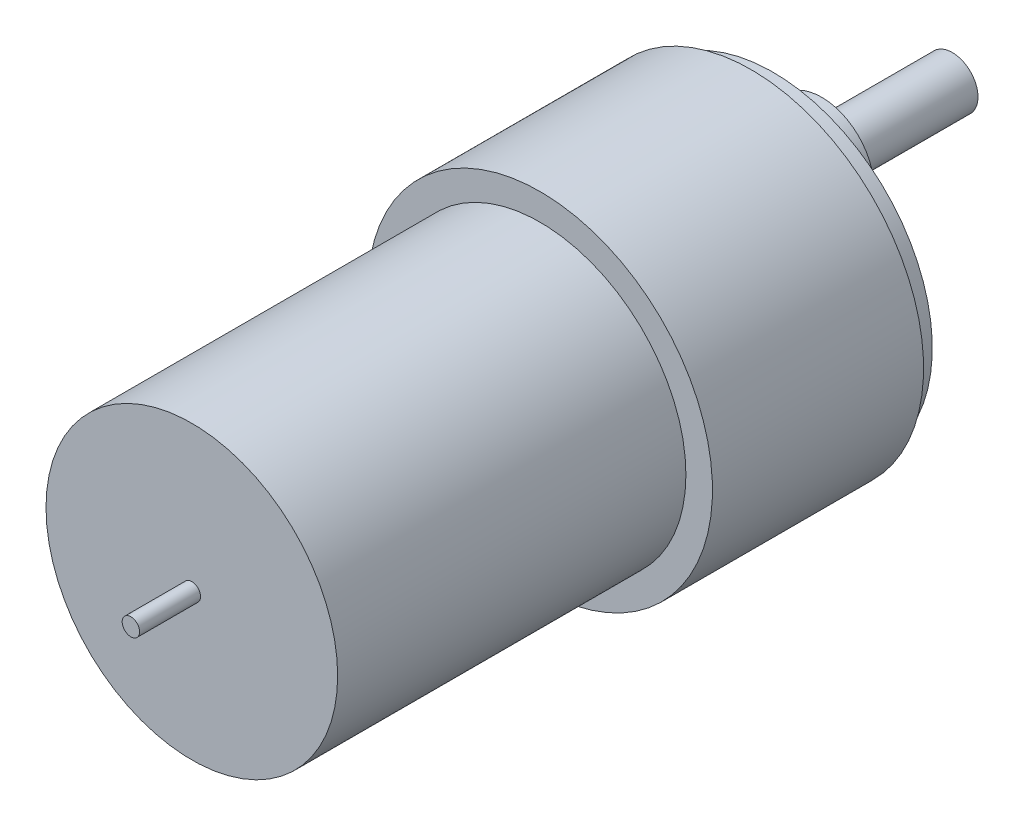
ISO-10303-21;
HEADER;
FILE_DESCRIPTION(('STEP AP214'),'2;1');
FILE_NAME('part.step','',(''),(''),'','','');
FILE_SCHEMA(('AUTOMOTIVE_DESIGN { 1 0 10303 214 1 1 1 1 }'));
ENDSEC;
DATA;
#1=APPLICATION_CONTEXT('core data for automotive mechanical design processes');
#2=APPLICATION_PROTOCOL_DEFINITION('international standard','automotive_design',2000,#1);
#3=PRODUCT_CONTEXT('',#1,'mechanical');
#4=PRODUCT('Part','Part','',(#3));
#5=PRODUCT_RELATED_PRODUCT_CATEGORY('part','',(#4));
#6=PRODUCT_DEFINITION_FORMATION('','',#4);
#7=PRODUCT_DEFINITION_CONTEXT('part definition',#1,'design');
#8=PRODUCT_DEFINITION('design','',#6,#7);
#9=PRODUCT_DEFINITION_SHAPE('','',#8);
#10=(LENGTH_UNIT() NAMED_UNIT(*) SI_UNIT(.MILLI.,.METRE.));
#11=(NAMED_UNIT(*) PLANE_ANGLE_UNIT() SI_UNIT($,.RADIAN.));
#12=(NAMED_UNIT(*) SI_UNIT($,.STERADIAN.) SOLID_ANGLE_UNIT());
#13=UNCERTAINTY_MEASURE_WITH_UNIT(LENGTH_MEASURE(1.E-05),#10,'distance_accuracy_value','');
#14=(GEOMETRIC_REPRESENTATION_CONTEXT(3) GLOBAL_UNCERTAINTY_ASSIGNED_CONTEXT((#13)) GLOBAL_UNIT_ASSIGNED_CONTEXT((#10,
#11,#12)) REPRESENTATION_CONTEXT('',''));
#15=CARTESIAN_POINT('',(0.,0.,0.));
#16=DIRECTION('',(0.,0.,1.));
#17=DIRECTION('',(1.,0.,0.));
#18=AXIS2_PLACEMENT_3D('',#15,#16,#17);
#19=CARTESIAN_POINT('',(0.,0.,24.25));
#20=DIRECTION('',(0.,0.,-1.));
#21=DIRECTION('',(-1.,0.,0.));
#22=AXIS2_PLACEMENT_3D('',#19,#20,#21);
#23=CYLINDRICAL_SURFACE('',#22,19.8);
#24=CARTESIAN_POINT('',(0.,0.,24.25));
#25=DIRECTION('',(0.,0.,1.));
#26=DIRECTION('',(1.,0.,0.));
#27=AXIS2_PLACEMENT_3D('',#24,#25,#26);
#28=CIRCLE('',#27,19.8);
#29=CARTESIAN_POINT('',(-19.8,0.,24.25));
#30=VERTEX_POINT('',#29);
#31=EDGE_CURVE('E94',#30,#30,#28,.T.);
#32=CARTESIAN_POINT('',(0.,0.,0.));
#33=DIRECTION('',(0.,0.,1.));
#34=DIRECTION('',(1.,0.,0.));
#35=AXIS2_PLACEMENT_3D('',#32,#33,#34);
#36=CIRCLE('',#35,19.8);
#37=CARTESIAN_POINT('',(-19.8,0.,0.));
#38=VERTEX_POINT('',#37);
#39=EDGE_CURVE('E36',#38,#38,#36,.T.);
#40=CARTESIAN_POINT('',(-19.8,0.,24.25));
#41=CARTESIAN_POINT('',(-19.8,0.,23.9973958333333));
#42=CARTESIAN_POINT('',(-19.8,0.,23.7447916666667));
#43=CARTESIAN_POINT('',(-19.8,0.,23.2395833333333));
#44=CARTESIAN_POINT('',(-19.8,0.,22.9869791666667));
#45=CARTESIAN_POINT('',(-19.8,0.,22.4817708333333));
#46=CARTESIAN_POINT('',(-19.8,0.,22.2291666666667));
#47=CARTESIAN_POINT('',(-19.8,0.,21.7239583333333));
#48=CARTESIAN_POINT('',(-19.8,0.,21.4713541666667));
#49=CARTESIAN_POINT('',(-19.8,0.,20.9661458333333));
#50=CARTESIAN_POINT('',(-19.8,0.,20.7135416666667));
#51=CARTESIAN_POINT('',(-19.8,0.,20.2083333333333));
#52=CARTESIAN_POINT('',(-19.8,0.,19.9557291666667));
#53=CARTESIAN_POINT('',(-19.8,0.,19.4505208333333));
#54=CARTESIAN_POINT('',(-19.8,0.,19.1979166666667));
#55=CARTESIAN_POINT('',(-19.8,0.,18.6927083333333));
#56=CARTESIAN_POINT('',(-19.8,0.,18.4401041666667));
#57=CARTESIAN_POINT('',(-19.8,0.,17.9348958333333));
#58=CARTESIAN_POINT('',(-19.8,0.,17.6822916666667));
#59=CARTESIAN_POINT('',(-19.8,0.,17.1770833333333));
#60=CARTESIAN_POINT('',(-19.8,0.,16.9244791666667));
#61=CARTESIAN_POINT('',(-19.8,0.,16.4192708333333));
#62=CARTESIAN_POINT('',(-19.8,0.,16.1666666666667));
#63=CARTESIAN_POINT('',(-19.8,0.,15.6614583333333));
#64=CARTESIAN_POINT('',(-19.8,0.,15.4088541666667));
#65=CARTESIAN_POINT('',(-19.8,0.,14.9036458333333));
#66=CARTESIAN_POINT('',(-19.8,0.,14.6510416666667));
#67=CARTESIAN_POINT('',(-19.8,0.,14.1458333333333));
#68=CARTESIAN_POINT('',(-19.8,0.,13.8932291666667));
#69=CARTESIAN_POINT('',(-19.8,0.,13.3880208333333));
#70=CARTESIAN_POINT('',(-19.8,0.,13.1354166666667));
#71=CARTESIAN_POINT('',(-19.8,0.,12.6302083333333));
#72=CARTESIAN_POINT('',(-19.8,0.,12.3776041666667));
#73=CARTESIAN_POINT('',(-19.8,0.,11.8723958333333));
#74=CARTESIAN_POINT('',(-19.8,0.,11.6197916666667));
#75=CARTESIAN_POINT('',(-19.8,0.,11.1145833333333));
#76=CARTESIAN_POINT('',(-19.8,0.,10.8619791666667));
#77=CARTESIAN_POINT('',(-19.8,0.,10.3567708333333));
#78=CARTESIAN_POINT('',(-19.8,0.,10.1041666666667));
#79=CARTESIAN_POINT('',(-19.8,0.,9.59895833333333));
#80=CARTESIAN_POINT('',(-19.8,0.,9.34635416666666));
#81=CARTESIAN_POINT('',(-19.8,0.,8.84114583333333));
#82=CARTESIAN_POINT('',(-19.8,0.,8.58854166666666));
#83=CARTESIAN_POINT('',(-19.8,0.,8.08333333333333));
#84=CARTESIAN_POINT('',(-19.8,0.,7.83072916666666));
#85=CARTESIAN_POINT('',(-19.8,0.,7.32552083333333));
#86=CARTESIAN_POINT('',(-19.8,0.,7.07291666666667));
#87=CARTESIAN_POINT('',(-19.8,0.,6.56770833333333));
#88=CARTESIAN_POINT('',(-19.8,0.,6.31510416666667));
#89=CARTESIAN_POINT('',(-19.8,0.,5.80989583333333));
#90=CARTESIAN_POINT('',(-19.8,0.,5.55729166666667));
#91=CARTESIAN_POINT('',(-19.8,0.,5.05208333333333));
#92=CARTESIAN_POINT('',(-19.8,0.,4.79947916666667));
#93=CARTESIAN_POINT('',(-19.8,0.,4.29427083333333));
#94=CARTESIAN_POINT('',(-19.8,0.,4.04166666666666));
#95=CARTESIAN_POINT('',(-19.8,0.,3.53645833333333));
#96=CARTESIAN_POINT('',(-19.8,0.,3.28385416666666));
#97=CARTESIAN_POINT('',(-19.8,0.,2.77864583333333));
#98=CARTESIAN_POINT('',(-19.8,0.,2.52604166666666));
#99=CARTESIAN_POINT('',(-19.8,0.,2.02083333333333));
#100=CARTESIAN_POINT('',(-19.8,0.,1.76822916666666));
#101=CARTESIAN_POINT('',(-19.8,0.,1.26302083333333));
#102=CARTESIAN_POINT('',(-19.8,0.,1.01041666666666));
#103=CARTESIAN_POINT('',(-19.8,0.,0.50520833333333));
#104=CARTESIAN_POINT('',(-19.8,0.,0.252604166666663));
#105=CARTESIAN_POINT('',(-19.8,0.,0.));
#106=B_SPLINE_CURVE_WITH_KNOTS('',3,(#40,#41,#42,#43,#44,#45,#46,#47,#48,#49,#50,#51,#52,#53,
#54,#55,#56,#57,#58,#59,#60,#61,#62,#63,#64,#65,#66,#67,#68,#69,#70,#71,#72,#73,#74,#75,#76,#77,
#78,#79,#80,#81,#82,#83,#84,#85,#86,#87,#88,#89,#90,#91,#92,#93,#94,#95,#96,#97,#98,#99,#100,
#101,#102,#103,#104,#105),.UNSPECIFIED.,.F.,.F.,(4,2,2,2,2,2,2,2,2,2,2,2,2,2,2,2,2,2,2,2,2,2,2,
2,2,2,2,2,2,2,2,2,4),(0.,0.7578125,1.515625,2.2734375,3.03125,3.7890625,4.546875,5.3046875,
6.0625,6.8203125,7.578125,8.3359375,9.09375,9.8515625,10.609375,11.3671875,12.125,12.8828125,
13.640625,14.3984375,15.15625,15.9140625,16.671875,17.4296875,18.1875,18.9453125,19.703125,
20.4609375,21.21875,21.9765625,22.734375,23.4921875,24.25),.UNSPECIFIED.);
#107=EDGE_CURVE('BSEAM33',#30,#38,#106,.T.);
#108=ORIENTED_EDGE('',*,*,#31,.F.);
#109=ORIENTED_EDGE('',*,*,#39,.T.);
#110=ORIENTED_EDGE('',*,*,#107,.T.);
#111=ORIENTED_EDGE('',*,*,#107,.F.);
#112=EDGE_LOOP('',(#108,#110,#109,#111));
#113=FACE_BOUND('',#112,.T.);
#114=ADVANCED_FACE('F33',(#113),#23,.T.);
#115=CARTESIAN_POINT('',(0.,0.,24.25));
#116=DIRECTION('',(0.,0.,1.));
#117=DIRECTION('',(1.,0.,0.));
#118=AXIS2_PLACEMENT_3D('',#115,#116,#117);
#119=PLANE('',#118);
#120=CARTESIAN_POINT('',(0.,0.,24.25));
#121=DIRECTION('',(0.,0.,1.));
#122=DIRECTION('',(1.,0.,0.));
#123=AXIS2_PLACEMENT_3D('',#120,#121,#122);
#124=CIRCLE('',#123,16.75);
#125=CARTESIAN_POINT('',(16.75,0.,24.25));
#126=VERTEX_POINT('',#125);
#127=EDGE_CURVE('E41',#126,#126,#124,.T.);
#128=ORIENTED_EDGE('',*,*,#127,.F.);
#129=EDGE_LOOP('',(#128));
#130=FACE_BOUND('',#129,.T.);
#131=ORIENTED_EDGE('',*,*,#31,.T.);
#132=EDGE_LOOP('',(#131));
#133=FACE_BOUND('',#132,.T.);
#134=ADVANCED_FACE('F105',(#130,#133),#119,.T.);
#135=CARTESIAN_POINT('',(0.,0.,0.));
#136=DIRECTION('',(0.,0.,1.));
#137=DIRECTION('',(1.,0.,0.));
#138=AXIS2_PLACEMENT_3D('',#135,#136,#137);
#139=PLANE('',#138);
#140=CARTESIAN_POINT('',(0.,0.,0.));
#141=DIRECTION('',(0.,0.,-1.));
#142=DIRECTION('',(-1.,0.,0.));
#143=AXIS2_PLACEMENT_3D('',#140,#141,#142);
#144=CIRCLE('',#143,18.3);
#145=CARTESIAN_POINT('',(-18.3,0.,0.));
#146=VERTEX_POINT('',#145);
#147=EDGE_CURVE('E11',#146,#146,#144,.T.);
#148=ORIENTED_EDGE('',*,*,#147,.F.);
#149=EDGE_LOOP('',(#148));
#150=FACE_BOUND('',#149,.T.);
#151=ORIENTED_EDGE('',*,*,#39,.F.);
#152=EDGE_LOOP('',(#151));
#153=FACE_BOUND('',#152,.T.);
#154=ADVANCED_FACE('F102',(#150,#153),#139,.F.);
#155=CARTESIAN_POINT('',(0.,0.,64.25));
#156=DIRECTION('',(0.,0.,-1.));
#157=DIRECTION('',(-1.,0.,0.));
#158=AXIS2_PLACEMENT_3D('',#155,#156,#157);
#159=CYLINDRICAL_SURFACE('',#158,16.75);
#160=CARTESIAN_POINT('',(0.,0.,64.25));
#161=DIRECTION('',(0.,0.,1.));
#162=DIRECTION('',(1.,0.,0.));
#163=AXIS2_PLACEMENT_3D('',#160,#161,#162);
#164=CIRCLE('',#163,16.75);
#165=CARTESIAN_POINT('',(16.75,0.,64.25));
#166=VERTEX_POINT('',#165);
#167=EDGE_CURVE('E89',#166,#166,#164,.T.);
#168=ORIENTED_EDGE('',*,*,#167,.F.);
#169=EDGE_LOOP('',(#168));
#170=FACE_BOUND('',#169,.T.);
#171=ORIENTED_EDGE('',*,*,#127,.T.);
#172=EDGE_LOOP('',(#171));
#173=FACE_BOUND('',#172,.T.);
#174=ADVANCED_FACE('F104',(#170,#173),#159,.T.);
#175=CARTESIAN_POINT('',(0.,0.,64.25));
#176=DIRECTION('',(0.,0.,1.));
#177=DIRECTION('',(1.,0.,0.));
#178=AXIS2_PLACEMENT_3D('',#175,#176,#177);
#179=PLANE('',#178);
#180=CARTESIAN_POINT('',(0.,0.,64.25));
#181=DIRECTION('',(0.,0.,1.));
#182=DIRECTION('',(1.,0.,0.));
#183=AXIS2_PLACEMENT_3D('',#180,#181,#182);
#184=CIRCLE('',#183,1.);
#185=CARTESIAN_POINT('',(1.,0.,64.25));
#186=VERTEX_POINT('',#185);
#187=EDGE_CURVE('E355',#186,#186,#184,.T.);
#188=ORIENTED_EDGE('',*,*,#187,.F.);
#189=EDGE_LOOP('',(#188));
#190=FACE_BOUND('',#189,.T.);
#191=ORIENTED_EDGE('',*,*,#167,.T.);
#192=EDGE_LOOP('',(#191));
#193=FACE_BOUND('',#192,.T.);
#194=ADVANCED_FACE('F111',(#190,#193),#179,.T.);
#195=CARTESIAN_POINT('',(0.,0.,-2.5));
#196=DIRECTION('',(0.,0.,1.));
#197=DIRECTION('',(1.,0.,0.));
#198=AXIS2_PLACEMENT_3D('',#195,#196,#197);
#199=CYLINDRICAL_SURFACE('',#198,18.3);
#200=CARTESIAN_POINT('',(0.,0.,-2.5));
#201=DIRECTION('',(0.,0.,-1.));
#202=DIRECTION('',(-1.,0.,0.));
#203=AXIS2_PLACEMENT_3D('',#200,#201,#202);
#204=CIRCLE('',#203,18.3);
#205=CARTESIAN_POINT('',(-18.3,0.,-2.5));
#206=VERTEX_POINT('',#205);
#207=EDGE_CURVE('E85',#206,#206,#204,.T.);
#208=ORIENTED_EDGE('',*,*,#207,.F.);
#209=EDGE_LOOP('',(#208));
#210=FACE_BOUND('',#209,.T.);
#211=ORIENTED_EDGE('',*,*,#147,.T.);
#212=EDGE_LOOP('',(#211));
#213=FACE_BOUND('',#212,.T.);
#214=ADVANCED_FACE('F142',(#210,#213),#199,.T.);
#215=CARTESIAN_POINT('',(0.,0.,-2.5));
#216=DIRECTION('',(0.,0.,-1.));
#217=DIRECTION('',(-1.,0.,0.));
#218=AXIS2_PLACEMENT_3D('',#215,#216,#217);
#219=PLANE('',#218);
#220=CARTESIAN_POINT('',(7.75000000000016,13.4233937586587,-2.5));
#221=DIRECTION('',(0.,0.,-1.));
#222=DIRECTION('',(-0.50000000000001,-0.866025403784433,0.));
#223=AXIS2_PLACEMENT_3D('',#220,#221,#222);
#224=CIRCLE('',#223,1.5);
#225=CARTESIAN_POINT('',(7.00000000000014,12.1243556529821,-2.5));
#226=VERTEX_POINT('',#225);
#227=EDGE_CURVE('E354',#226,#226,#224,.T.);
#228=ORIENTED_EDGE('',*,*,#227,.F.);
#229=EDGE_LOOP('',(#228));
#230=FACE_BOUND('',#229,.T.);
#231=CARTESIAN_POINT('',(-7.74999999999987,13.4233937586589,-2.5));
#232=DIRECTION('',(0.,0.,-1.));
#233=DIRECTION('',(0.499999999999992,-0.866025403784443,0.));
#234=AXIS2_PLACEMENT_3D('',#231,#232,#233);
#235=CIRCLE('',#234,1.5);
#236=CARTESIAN_POINT('',(-6.99999999999989,12.1243556529822,-2.5));
#237=VERTEX_POINT('',#236);
#238=EDGE_CURVE('E379',#237,#237,#235,.T.);
#239=ORIENTED_EDGE('',*,*,#238,.F.);
#240=EDGE_LOOP('',(#239));
#241=FACE_BOUND('',#240,.T.);
#242=CARTESIAN_POINT('',(-15.5,0.,-2.5));
#243=DIRECTION('',(0.,0.,-1.));
#244=DIRECTION('',(1.,0.,0.));
#245=AXIS2_PLACEMENT_3D('',#242,#243,#244);
#246=CIRCLE('',#245,1.5);
#247=CARTESIAN_POINT('',(-14.,0.,-2.5));
#248=VERTEX_POINT('',#247);
#249=EDGE_CURVE('E373',#248,#248,#246,.T.);
#250=ORIENTED_EDGE('',*,*,#249,.F.);
#251=EDGE_LOOP('',(#250));
#252=FACE_BOUND('',#251,.T.);
#253=CARTESIAN_POINT('',(-7.75000000000006,-13.4233937586588,-2.5));
#254=DIRECTION('',(0.,0.,-1.));
#255=DIRECTION('',(0.500000000000004,0.866025403784436,0.));
#256=AXIS2_PLACEMENT_3D('',#253,#254,#255);
#257=CIRCLE('',#256,1.5);
#258=CARTESIAN_POINT('',(-7.00000000000006,-12.1243556529821,-2.5));
#259=VERTEX_POINT('',#258);
#260=EDGE_CURVE('E367',#259,#259,#257,.T.);
#261=ORIENTED_EDGE('',*,*,#260,.F.);
#262=EDGE_LOOP('',(#261));
#263=FACE_BOUND('',#262,.T.);
#264=CARTESIAN_POINT('',(7.74999999999997,-13.4233937586588,-2.5));
#265=DIRECTION('',(0.,0.,-1.));
#266=DIRECTION('',(-0.499999999999998,0.86602540378444,0.));
#267=AXIS2_PLACEMENT_3D('',#264,#265,#266);
#268=CIRCLE('',#267,1.5);
#269=CARTESIAN_POINT('',(6.99999999999997,-12.1243556529822,-2.5));
#270=VERTEX_POINT('',#269);
#271=EDGE_CURVE('E366',#270,#270,#268,.T.);
#272=ORIENTED_EDGE('',*,*,#271,.F.);
#273=EDGE_LOOP('',(#272));
#274=FACE_BOUND('',#273,.T.);
#275=CARTESIAN_POINT('',(15.5,0.,-2.5));
#276=DIRECTION('',(0.,0.,-1.));
#277=DIRECTION('',(-1.,0.,0.));
#278=AXIS2_PLACEMENT_3D('',#275,#276,#277);
#279=CIRCLE('',#278,1.5);
#280=CARTESIAN_POINT('',(14.,0.,-2.5));
#281=VERTEX_POINT('',#280);
#282=EDGE_CURVE('E387',#281,#281,#279,.T.);
#283=ORIENTED_EDGE('',*,*,#282,.F.);
#284=EDGE_LOOP('',(#283));
#285=FACE_BOUND('',#284,.T.);
#286=CARTESIAN_POINT('',(0.,7.,-2.5));
#287=DIRECTION('',(0.,0.,-1.));
#288=DIRECTION('',(-1.,0.,0.));
#289=AXIS2_PLACEMENT_3D('',#286,#287,#288);
#290=CIRCLE('',#289,6.);
#291=CARTESIAN_POINT('',(-6.,7.,-2.5));
#292=VERTEX_POINT('',#291);
#293=EDGE_CURVE('E78',#292,#292,#290,.T.);
#294=ORIENTED_EDGE('',*,*,#293,.F.);
#295=EDGE_LOOP('',(#294));
#296=FACE_BOUND('',#295,.T.);
#297=ORIENTED_EDGE('',*,*,#207,.T.);
#298=EDGE_LOOP('',(#297));
#299=FACE_BOUND('',#298,.T.);
#300=ADVANCED_FACE('F147',(#230,#241,#252,#263,#274,#285,#296,#299),#219,.T.);
#301=CARTESIAN_POINT('',(0.,7.,-8.1));
#302=DIRECTION('',(0.,0.,1.));
#303=DIRECTION('',(1.,0.,0.));
#304=AXIS2_PLACEMENT_3D('',#301,#302,#303);
#305=CYLINDRICAL_SURFACE('',#304,6.);
#306=CARTESIAN_POINT('',(0.,7.,-8.1));
#307=DIRECTION('',(0.,0.,-1.));
#308=DIRECTION('',(-1.,0.,0.));
#309=AXIS2_PLACEMENT_3D('',#306,#307,#308);
#310=CIRCLE('',#309,6.);
#311=CARTESIAN_POINT('',(-6.,7.,-8.1));
#312=VERTEX_POINT('',#311);
#313=EDGE_CURVE('E82',#312,#312,#310,.T.);
#314=ORIENTED_EDGE('',*,*,#313,.F.);
#315=EDGE_LOOP('',(#314));
#316=FACE_BOUND('',#315,.T.);
#317=ORIENTED_EDGE('',*,*,#293,.T.);
#318=EDGE_LOOP('',(#317));
#319=FACE_BOUND('',#318,.T.);
#320=ADVANCED_FACE('F155',(#316,#319),#305,.T.);
#321=CARTESIAN_POINT('',(0.,7.,-8.1));
#322=DIRECTION('',(0.,0.,-1.));
#323=DIRECTION('',(-1.,0.,0.));
#324=AXIS2_PLACEMENT_3D('',#321,#322,#323);
#325=PLANE('',#324);
#326=CARTESIAN_POINT('',(0.,7.,-8.1));
#327=DIRECTION('',(0.,0.,-1.));
#328=DIRECTION('',(1.,0.,0.));
#329=AXIS2_PLACEMENT_3D('',#326,#327,#328);
#330=CIRCLE('',#329,2.95);
#331=CARTESIAN_POINT('',(-1.71537167984084,4.6,-8.1));
#332=VERTEX_POINT('',#331);
#333=CARTESIAN_POINT('',(1.71537167984084,4.6,-8.1));
#334=VERTEX_POINT('',#333);
#335=EDGE_CURVE('E61',#332,#334,#330,.T.);
#336=ORIENTED_EDGE('',*,*,#335,.F.);
#337=DIRECTION('',(-1.,0.,0.));
#338=VECTOR('',#337,1.);
#339=CARTESIAN_POINT('',(1.71537167984084,4.6,-8.1));
#340=LINE('',#339,#338);
#341=EDGE_CURVE('E48',#334,#332,#340,.T.);
#342=ORIENTED_EDGE('',*,*,#341,.F.);
#343=EDGE_LOOP('',(#336,#342));
#344=FACE_BOUND('',#343,.T.);
#345=ORIENTED_EDGE('',*,*,#313,.T.);
#346=EDGE_LOOP('',(#345));
#347=FACE_BOUND('',#346,.T.);
#348=ADVANCED_FACE('F62',(#344,#347),#325,.T.);
#349=CARTESIAN_POINT('',(0.,7.,-23.1));
#350=DIRECTION('',(0.,0.,1.));
#351=DIRECTION('',(1.,0.,0.));
#352=AXIS2_PLACEMENT_3D('',#349,#350,#351);
#353=CYLINDRICAL_SURFACE('',#352,2.95);
#354=ORIENTED_EDGE('',*,*,#335,.T.);
#355=DIRECTION('',(0.,0.,1.));
#356=VECTOR('',#355,1.);
#357=CARTESIAN_POINT('',(1.71537167984084,4.6,-23.1));
#358=LINE('',#357,#356);
#359=CARTESIAN_POINT('',(1.71537167984084,4.6,-23.1));
#360=VERTEX_POINT('',#359);
#361=EDGE_CURVE('E73',#360,#334,#358,.T.);
#362=ORIENTED_EDGE('',*,*,#361,.F.);
#363=CARTESIAN_POINT('',(0.,7.,-23.1));
#364=DIRECTION('',(0.,0.,-1.));
#365=DIRECTION('',(1.,0.,0.));
#366=AXIS2_PLACEMENT_3D('',#363,#364,#365);
#367=CIRCLE('',#366,2.95);
#368=CARTESIAN_POINT('',(-1.71537167984084,4.6,-23.1));
#369=VERTEX_POINT('',#368);
#370=EDGE_CURVE('E74',#369,#360,#367,.T.);
#371=ORIENTED_EDGE('',*,*,#370,.F.);
#372=DIRECTION('',(0.,0.,1.));
#373=VECTOR('',#372,1.);
#374=CARTESIAN_POINT('',(-1.71537167984084,4.6,-23.1));
#375=LINE('',#374,#373);
#376=EDGE_CURVE('E71',#369,#332,#375,.T.);
#377=ORIENTED_EDGE('',*,*,#376,.T.);
#378=EDGE_LOOP('',(#354,#362,#371,#377));
#379=FACE_BOUND('',#378,.T.);
#380=ADVANCED_FACE('F76',(#379),#353,.T.);
#381=CARTESIAN_POINT('',(1.71537167984084,4.6,-23.1));
#382=DIRECTION('',(0.,1.,0.));
#383=DIRECTION('',(0.,0.,1.));
#384=AXIS2_PLACEMENT_3D('',#381,#382,#383);
#385=PLANE('',#384);
#386=ORIENTED_EDGE('',*,*,#341,.T.);
#387=ORIENTED_EDGE('',*,*,#376,.F.);
#388=DIRECTION('',(-1.,0.,0.));
#389=VECTOR('',#388,1.);
#390=CARTESIAN_POINT('',(1.71537167984084,4.6,-23.1));
#391=LINE('',#390,#389);
#392=EDGE_CURVE('E56',#360,#369,#391,.T.);
#393=ORIENTED_EDGE('',*,*,#392,.F.);
#394=ORIENTED_EDGE('',*,*,#361,.T.);
#395=EDGE_LOOP('',(#386,#387,#393,#394));
#396=FACE_BOUND('',#395,.T.);
#397=ADVANCED_FACE('F70',(#396),#385,.F.);
#398=CARTESIAN_POINT('',(0.,7.,-23.1));
#399=DIRECTION('',(0.,0.,1.));
#400=DIRECTION('',(1.,0.,0.));
#401=AXIS2_PLACEMENT_3D('',#398,#399,#400);
#402=PLANE('',#401);
#403=ORIENTED_EDGE('',*,*,#370,.T.);
#404=ORIENTED_EDGE('',*,*,#392,.T.);
#405=EDGE_LOOP('',(#403,#404));
#406=FACE_BOUND('',#405,.T.);
#407=ADVANCED_FACE('F185',(#406),#402,.F.);
#408=CARTESIAN_POINT('',(15.5,0.,1.5));
#409=DIRECTION('',(0.,0.,-1.));
#410=DIRECTION('',(-1.,0.,0.));
#411=AXIS2_PLACEMENT_3D('',#408,#409,#410);
#412=CYLINDRICAL_SURFACE('',#411,1.5);
#413=CARTESIAN_POINT('',(15.5,0.,1.5));
#414=DIRECTION('',(0.,0.,-1.));
#415=DIRECTION('',(-1.,0.,0.));
#416=AXIS2_PLACEMENT_3D('',#413,#414,#415);
#417=CIRCLE('',#416,1.5);
#418=CARTESIAN_POINT('',(14.,0.,1.5));
#419=VERTEX_POINT('',#418);
#420=EDGE_CURVE('E67',#419,#419,#417,.T.);
#421=ORIENTED_EDGE('',*,*,#420,.F.);
#422=EDGE_LOOP('',(#421));
#423=FACE_BOUND('',#422,.T.);
#424=ORIENTED_EDGE('',*,*,#282,.T.);
#425=EDGE_LOOP('',(#424));
#426=FACE_BOUND('',#425,.T.);
#427=ADVANCED_FACE('F194',(#423,#426),#412,.F.);
#428=CARTESIAN_POINT('',(15.5,0.,1.5));
#429=DIRECTION('',(0.,0.,-1.));
#430=DIRECTION('',(-1.,0.,0.));
#431=AXIS2_PLACEMENT_3D('',#428,#429,#430);
#432=PLANE('',#431);
#433=ORIENTED_EDGE('',*,*,#420,.T.);
#434=EDGE_LOOP('',(#433));
#435=FACE_BOUND('',#434,.T.);
#436=ADVANCED_FACE('F203',(#435),#432,.T.);
#437=CARTESIAN_POINT('',(7.74999999999997,-13.4233937586588,1.5));
#438=DIRECTION('',(0.,0.,-1.));
#439=DIRECTION('',(-1.,0.,0.));
#440=AXIS2_PLACEMENT_3D('',#437,#438,#439);
#441=CYLINDRICAL_SURFACE('',#440,1.5);
#442=CARTESIAN_POINT('',(7.74999999999997,-13.4233937586588,1.5));
#443=DIRECTION('',(0.,0.,-1.));
#444=DIRECTION('',(-0.499999999999998,0.86602540378444,0.));
#445=AXIS2_PLACEMENT_3D('',#442,#443,#444);
#446=CIRCLE('',#445,1.5);
#447=CARTESIAN_POINT('',(6.99999999999997,-12.1243556529822,1.5));
#448=VERTEX_POINT('',#447);
#449=EDGE_CURVE('E384',#448,#448,#446,.T.);
#450=ORIENTED_EDGE('',*,*,#449,.F.);
#451=EDGE_LOOP('',(#450));
#452=FACE_BOUND('',#451,.T.);
#453=ORIENTED_EDGE('',*,*,#271,.T.);
#454=EDGE_LOOP('',(#453));
#455=FACE_BOUND('',#454,.T.);
#456=ADVANCED_FACE('F213',(#452,#455),#441,.F.);
#457=CARTESIAN_POINT('',(7.74999999999997,-13.4233937586588,1.5));
#458=DIRECTION('',(0.,0.,-1.));
#459=DIRECTION('',(-0.499999999999998,0.86602540378444,0.));
#460=AXIS2_PLACEMENT_3D('',#457,#458,#459);
#461=PLANE('',#460);
#462=ORIENTED_EDGE('',*,*,#449,.T.);
#463=EDGE_LOOP('',(#462));
#464=FACE_BOUND('',#463,.T.);
#465=ADVANCED_FACE('F230',(#464),#461,.T.);
#466=CARTESIAN_POINT('',(-7.75000000000006,-13.4233937586588,1.5));
#467=DIRECTION('',(0.,0.,-1.));
#468=DIRECTION('',(-1.,0.,0.));
#469=AXIS2_PLACEMENT_3D('',#466,#467,#468);
#470=CYLINDRICAL_SURFACE('',#469,1.5);
#471=CARTESIAN_POINT('',(-7.75000000000006,-13.4233937586588,1.5));
#472=DIRECTION('',(0.,0.,-1.));
#473=DIRECTION('',(0.500000000000004,0.866025403784436,0.));
#474=AXIS2_PLACEMENT_3D('',#471,#472,#473);
#475=CIRCLE('',#474,1.5);
#476=CARTESIAN_POINT('',(-7.00000000000006,-12.1243556529821,1.5));
#477=VERTEX_POINT('',#476);
#478=EDGE_CURVE('E363',#477,#477,#475,.T.);
#479=ORIENTED_EDGE('',*,*,#478,.F.);
#480=EDGE_LOOP('',(#479));
#481=FACE_BOUND('',#480,.T.);
#482=ORIENTED_EDGE('',*,*,#260,.T.);
#483=EDGE_LOOP('',(#482));
#484=FACE_BOUND('',#483,.T.);
#485=ADVANCED_FACE('F240',(#481,#484),#470,.F.);
#486=CARTESIAN_POINT('',(-7.75000000000006,-13.4233937586588,1.5));
#487=DIRECTION('',(0.,0.,-1.));
#488=DIRECTION('',(0.500000000000004,0.866025403784436,0.));
#489=AXIS2_PLACEMENT_3D('',#486,#487,#488);
#490=PLANE('',#489);
#491=ORIENTED_EDGE('',*,*,#478,.T.);
#492=EDGE_LOOP('',(#491));
#493=FACE_BOUND('',#492,.T.);
#494=ADVANCED_FACE('F250',(#493),#490,.T.);
#495=CARTESIAN_POINT('',(-15.5,0.,1.5));
#496=DIRECTION('',(0.,0.,-1.));
#497=DIRECTION('',(-1.,0.,0.));
#498=AXIS2_PLACEMENT_3D('',#495,#496,#497);
#499=CYLINDRICAL_SURFACE('',#498,1.5);
#500=CARTESIAN_POINT('',(-15.5,0.,1.5));
#501=DIRECTION('',(0.,0.,-1.));
#502=DIRECTION('',(1.,0.,0.));
#503=AXIS2_PLACEMENT_3D('',#500,#501,#502);
#504=CIRCLE('',#503,1.5);
#505=CARTESIAN_POINT('',(-14.,0.,1.5));
#506=VERTEX_POINT('',#505);
#507=EDGE_CURVE('E370',#506,#506,#504,.T.);
#508=ORIENTED_EDGE('',*,*,#507,.F.);
#509=EDGE_LOOP('',(#508));
#510=FACE_BOUND('',#509,.T.);
#511=ORIENTED_EDGE('',*,*,#249,.T.);
#512=EDGE_LOOP('',(#511));
#513=FACE_BOUND('',#512,.T.);
#514=ADVANCED_FACE('F260',(#510,#513),#499,.F.);
#515=CARTESIAN_POINT('',(-15.5,0.,1.5));
#516=DIRECTION('',(0.,0.,-1.));
#517=DIRECTION('',(1.,0.,0.));
#518=AXIS2_PLACEMENT_3D('',#515,#516,#517);
#519=PLANE('',#518);
#520=ORIENTED_EDGE('',*,*,#507,.T.);
#521=EDGE_LOOP('',(#520));
#522=FACE_BOUND('',#521,.T.);
#523=ADVANCED_FACE('F270',(#522),#519,.T.);
#524=CARTESIAN_POINT('',(-7.74999999999987,13.4233937586589,1.5));
#525=DIRECTION('',(0.,0.,-1.));
#526=DIRECTION('',(-1.,0.,0.));
#527=AXIS2_PLACEMENT_3D('',#524,#525,#526);
#528=CYLINDRICAL_SURFACE('',#527,1.5);
#529=CARTESIAN_POINT('',(-7.74999999999987,13.4233937586589,1.5));
#530=DIRECTION('',(0.,0.,-1.));
#531=DIRECTION('',(0.499999999999992,-0.866025403784443,0.));
#532=AXIS2_PLACEMENT_3D('',#529,#530,#531);
#533=CIRCLE('',#532,1.5);
#534=CARTESIAN_POINT('',(-6.99999999999989,12.1243556529822,1.5));
#535=VERTEX_POINT('',#534);
#536=EDGE_CURVE('E376',#535,#535,#533,.T.);
#537=ORIENTED_EDGE('',*,*,#536,.F.);
#538=EDGE_LOOP('',(#537));
#539=FACE_BOUND('',#538,.T.);
#540=ORIENTED_EDGE('',*,*,#238,.T.);
#541=EDGE_LOOP('',(#540));
#542=FACE_BOUND('',#541,.T.);
#543=ADVANCED_FACE('F280',(#539,#542),#528,.F.);
#544=CARTESIAN_POINT('',(-7.74999999999987,13.4233937586589,1.5));
#545=DIRECTION('',(0.,0.,-1.));
#546=DIRECTION('',(0.499999999999992,-0.866025403784443,0.));
#547=AXIS2_PLACEMENT_3D('',#544,#545,#546);
#548=PLANE('',#547);
#549=ORIENTED_EDGE('',*,*,#536,.T.);
#550=EDGE_LOOP('',(#549));
#551=FACE_BOUND('',#550,.T.);
#552=ADVANCED_FACE('F290',(#551),#548,.T.);
#553=CARTESIAN_POINT('',(7.75000000000016,13.4233937586587,1.5));
#554=DIRECTION('',(0.,0.,-1.));
#555=DIRECTION('',(-1.,0.,0.));
#556=AXIS2_PLACEMENT_3D('',#553,#554,#555);
#557=CYLINDRICAL_SURFACE('',#556,1.5);
#558=CARTESIAN_POINT('',(7.75000000000016,13.4233937586587,1.5));
#559=DIRECTION('',(0.,0.,-1.));
#560=DIRECTION('',(-0.50000000000001,-0.866025403784433,0.));
#561=AXIS2_PLACEMENT_3D('',#558,#559,#560);
#562=CIRCLE('',#561,1.5);
#563=CARTESIAN_POINT('',(7.00000000000014,12.1243556529821,1.5));
#564=VERTEX_POINT('',#563);
#565=EDGE_CURVE('E358',#564,#564,#562,.T.);
#566=ORIENTED_EDGE('',*,*,#565,.F.);
#567=EDGE_LOOP('',(#566));
#568=FACE_BOUND('',#567,.T.);
#569=ORIENTED_EDGE('',*,*,#227,.T.);
#570=EDGE_LOOP('',(#569));
#571=FACE_BOUND('',#570,.T.);
#572=ADVANCED_FACE('F300',(#568,#571),#557,.F.);
#573=CARTESIAN_POINT('',(7.75000000000016,13.4233937586587,1.5));
#574=DIRECTION('',(0.,0.,-1.));
#575=DIRECTION('',(-0.50000000000001,-0.866025403784433,0.));
#576=AXIS2_PLACEMENT_3D('',#573,#574,#575);
#577=PLANE('',#576);
#578=ORIENTED_EDGE('',*,*,#565,.T.);
#579=EDGE_LOOP('',(#578));
#580=FACE_BOUND('',#579,.T.);
#581=ADVANCED_FACE('F310',(#580),#577,.T.);
#582=CARTESIAN_POINT('',(0.,0.,71.25));
#583=DIRECTION('',(0.,0.,-1.));
#584=DIRECTION('',(-1.,0.,0.));
#585=AXIS2_PLACEMENT_3D('',#582,#583,#584);
#586=CYLINDRICAL_SURFACE('',#585,1.);
#587=CARTESIAN_POINT('',(0.,0.,71.25));
#588=DIRECTION('',(0.,0.,1.));
#589=DIRECTION('',(1.,0.,0.));
#590=AXIS2_PLACEMENT_3D('',#587,#588,#589);
#591=CIRCLE('',#590,1.);
#592=CARTESIAN_POINT('',(1.,0.,71.25));
#593=VERTEX_POINT('',#592);
#594=EDGE_CURVE('E353',#593,#593,#591,.T.);
#595=ORIENTED_EDGE('',*,*,#594,.F.);
#596=EDGE_LOOP('',(#595));
#597=FACE_BOUND('',#596,.T.);
#598=ORIENTED_EDGE('',*,*,#187,.T.);
#599=EDGE_LOOP('',(#598));
#600=FACE_BOUND('',#599,.T.);
#601=ADVANCED_FACE('F320',(#597,#600),#586,.T.);
#602=CARTESIAN_POINT('',(0.,0.,71.25));
#603=DIRECTION('',(0.,0.,1.));
#604=DIRECTION('',(1.,0.,0.));
#605=AXIS2_PLACEMENT_3D('',#602,#603,#604);
#606=PLANE('',#605);
#607=ORIENTED_EDGE('',*,*,#594,.T.);
#608=EDGE_LOOP('',(#607));
#609=FACE_BOUND('',#608,.T.);
#610=ADVANCED_FACE('F337',(#609),#606,.T.);
#611=CLOSED_SHELL('',(#114,#134,#154,#174,#194,#214,#300,#320,#348,#380,#397,#407,#427,#436,
#456,#465,#485,#494,#514,#523,#543,#552,#572,#581,#601,#610));
#612=MANIFOLD_SOLID_BREP('B2',#611);
#613=ADVANCED_BREP_SHAPE_REPRESENTATION('',(#18,#612),#14);
#614=SHAPE_DEFINITION_REPRESENTATION(#9,#613);
ENDSEC;
END-ISO-10303-21;
